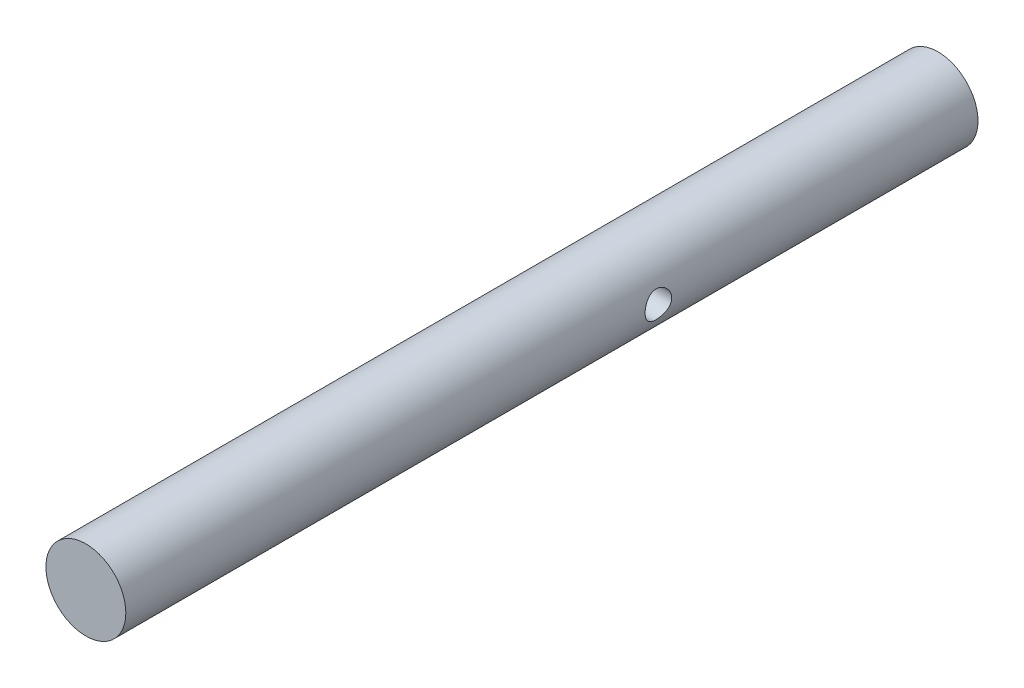
ISO-10303-21;
HEADER;
FILE_DESCRIPTION(('STEP AP214'),'2;1');
FILE_NAME('part.step','',(''),(''),'','','');
FILE_SCHEMA(('AUTOMOTIVE_DESIGN { 1 0 10303 214 1 1 1 1 }'));
ENDSEC;
DATA;
#1=APPLICATION_CONTEXT('core data for automotive mechanical design processes');
#2=APPLICATION_PROTOCOL_DEFINITION('international standard','automotive_design',2000,#1);
#3=PRODUCT_CONTEXT('',#1,'mechanical');
#4=PRODUCT('Part','Part','',(#3));
#5=PRODUCT_RELATED_PRODUCT_CATEGORY('part','',(#4));
#6=PRODUCT_DEFINITION_FORMATION('','',#4);
#7=PRODUCT_DEFINITION_CONTEXT('part definition',#1,'design');
#8=PRODUCT_DEFINITION('design','',#6,#7);
#9=PRODUCT_DEFINITION_SHAPE('','',#8);
#10=(LENGTH_UNIT() NAMED_UNIT(*) SI_UNIT(.MILLI.,.METRE.));
#11=(NAMED_UNIT(*) PLANE_ANGLE_UNIT() SI_UNIT($,.RADIAN.));
#12=(NAMED_UNIT(*) SI_UNIT($,.STERADIAN.) SOLID_ANGLE_UNIT());
#13=UNCERTAINTY_MEASURE_WITH_UNIT(LENGTH_MEASURE(1.E-05),#10,'distance_accuracy_value','');
#14=(GEOMETRIC_REPRESENTATION_CONTEXT(3) GLOBAL_UNCERTAINTY_ASSIGNED_CONTEXT((#13)) GLOBAL_UNIT_ASSIGNED_CONTEXT((#10,
#11,#12)) REPRESENTATION_CONTEXT('',''));
#15=CARTESIAN_POINT('',(0.,0.,0.));
#16=DIRECTION('',(0.,0.,1.));
#17=DIRECTION('',(1.,0.,0.));
#18=AXIS2_PLACEMENT_3D('',#15,#16,#17);
#19=CARTESIAN_POINT('',(0.,0.,101.6));
#20=DIRECTION('',(0.,0.,-1.));
#21=DIRECTION('',(-1.,0.,0.));
#22=AXIS2_PLACEMENT_3D('',#19,#20,#21);
#23=CYLINDRICAL_SURFACE('',#22,4.7625);
#24=CARTESIAN_POINT('',(0.,0.,101.6));
#25=DIRECTION('',(0.,0.,1.));
#26=DIRECTION('',(1.,0.,0.));
#27=AXIS2_PLACEMENT_3D('',#24,#25,#26);
#28=CIRCLE('',#27,4.7625);
#29=CARTESIAN_POINT('',(4.7625,0.,101.6));
#30=VERTEX_POINT('',#29);
#31=EDGE_CURVE('E45',#30,#30,#28,.T.);
#32=ORIENTED_EDGE('',*,*,#31,.F.);
#33=EDGE_LOOP('',(#32));
#34=FACE_BOUND('',#33,.T.);
#35=CARTESIAN_POINT('',(0.,0.,0.));
#36=DIRECTION('',(0.,0.,1.));
#37=DIRECTION('',(1.,0.,0.));
#38=AXIS2_PLACEMENT_3D('',#35,#36,#37);
#39=CIRCLE('',#38,4.7625);
#40=CARTESIAN_POINT('',(4.7625,0.,0.));
#41=VERTEX_POINT('',#40);
#42=EDGE_CURVE('E49',#41,#41,#39,.T.);
#43=ORIENTED_EDGE('',*,*,#42,.T.);
#44=EDGE_LOOP('',(#43));
#45=FACE_BOUND('',#44,.T.);
#46=CARTESIAN_POINT('',(-4.7625,0.,39.6875));
#47=CARTESIAN_POINT('',(-4.76250024290248,0.0866193385826731,39.687500402799));
#48=CARTESIAN_POINT('',(-4.76011509093227,0.173236246329948,39.680387577523));
#49=CARTESIAN_POINT('',(-4.75083521197708,0.343918795385843,39.6522112897526));
#50=CARTESIAN_POINT('',(-4.74394001683417,0.427984170888623,39.6311463789811));
#51=CARTESIAN_POINT('',(-4.72638926301478,0.591078303334069,39.5758682011278));
#52=CARTESIAN_POINT('',(-4.7157399927273,0.670115223594078,39.5416769133459));
#53=CARTESIAN_POINT('',(-4.6917680757628,0.821332712178451,39.4612158881191));
#54=CARTESIAN_POINT('',(-4.67844490185098,0.893511924171945,39.4149437680584));
#55=CARTESIAN_POINT('',(-4.65001124928271,1.03146490909785,39.3099515347867));
#56=CARTESIAN_POINT('',(-4.63485795886259,1.09696837422356,39.2508879156115));
#57=CARTESIAN_POINT('',(-4.60470749718205,1.21734689966455,39.1227196419033));
#58=CARTESIAN_POINT('',(-4.58971036098747,1.27221961946452,39.053612782051));
#59=CARTESIAN_POINT('',(-4.56109915307672,1.37132209578672,38.9048861296256));
#60=CARTESIAN_POINT('',(-4.54753724850155,1.41520046242589,38.8250211881752));
#61=CARTESIAN_POINT('',(-4.52398297352029,1.48878746228088,38.658520450047));
#62=CARTESIAN_POINT('',(-4.51398951405184,1.51850041960149,38.5718867290041));
#63=CARTESIAN_POINT('',(-4.49915443940136,1.56189912014579,38.397381260874));
#64=CARTESIAN_POINT('',(-4.49415052034258,1.57609134913143,38.3096496815236));
#65=CARTESIAN_POINT('',(-4.48938104899343,1.58962903329348,38.1329187902775));
#66=CARTESIAN_POINT('',(-4.48961387798584,1.58897907629748,38.0439198786242));
#67=CARTESIAN_POINT('',(-4.49514936325486,1.57324409712917,37.8715005991701));
#68=CARTESIAN_POINT('',(-4.50021985189709,1.5588200871526,37.788011160366));
#69=CARTESIAN_POINT('',(-4.51447944137725,1.51702478352344,37.6247129463742));
#70=CARTESIAN_POINT('',(-4.52366903532271,1.48965193971459,37.5449046131218));
#71=CARTESIAN_POINT('',(-4.54529683920858,1.42230325467058,37.3897322600235));
#72=CARTESIAN_POINT('',(-4.55778498196574,1.38213155232277,37.3144605095671));
#73=CARTESIAN_POINT('',(-4.58458186738966,1.29046145625623,37.1715174331059));
#74=CARTESIAN_POINT('',(-4.59889113542361,1.23895979087785,37.1038483109933));
#75=CARTESIAN_POINT('',(-4.62863135053789,1.12291706563305,36.9743170879198));
#76=CARTESIAN_POINT('',(-4.64408185600813,1.05783562574614,36.9129425974669));
#77=CARTESIAN_POINT('',(-4.67371014689421,0.91811406732747,36.8018516141719));
#78=CARTESIAN_POINT('',(-4.68788781016682,0.843473033111536,36.7521362394139));
#79=CARTESIAN_POINT('',(-4.71355908851247,0.685716835710943,36.6653821233768));
#80=CARTESIAN_POINT('',(-4.72502468137762,0.602524951310927,36.6284740324966));
#81=CARTESIAN_POINT('',(-4.7437765034179,0.430639669841147,36.5693274613453));
#82=CARTESIAN_POINT('',(-4.75106418427121,0.34194819557098,36.5470838852653));
#83=CARTESIAN_POINT('',(-4.76039857975912,0.165709329377761,36.5187616301895));
#84=CARTESIAN_POINT('',(-4.76265877911043,0.0782789897854344,36.5120240529383));
#85=CARTESIAN_POINT('',(-4.76232383028039,-0.096480423561885,36.5130281193376));
#86=CARTESIAN_POINT('',(-4.75972950165738,-0.183809511919953,36.520767318968));
#87=CARTESIAN_POINT('',(-4.75011789238403,-0.353250287758013,36.5499839035308));
#88=CARTESIAN_POINT('',(-4.74323090454018,-0.435439830850322,36.5710568521036));
#89=CARTESIAN_POINT('',(-4.72585806842736,-0.595083834245081,36.6258370930909));
#90=CARTESIAN_POINT('',(-4.71537176124097,-0.67253768925742,36.6595459966551));
#91=CARTESIAN_POINT('',(-4.69152178418572,-0.822782670524327,36.7396243105472));
#92=CARTESIAN_POINT('',(-4.6780896842481,-0.895397560257227,36.786303416837));
#93=CARTESIAN_POINT('',(-4.64987090592067,-1.03197791784025,36.8906332131464));
#94=CARTESIAN_POINT('',(-4.63508381455201,-1.09594073387548,36.9482872539504));
#95=CARTESIAN_POINT('',(-4.60496996168956,-1.2164258561425,37.076028767223));
#96=CARTESIAN_POINT('',(-4.58964920726292,-1.27247803867767,37.1465621477464));
#97=CARTESIAN_POINT('',(-4.5608870760535,-1.37200881668868,37.2963623638998));
#98=CARTESIAN_POINT('',(-4.54744571493928,-1.41548730734049,37.3756292723316));
#99=CARTESIAN_POINT('',(-4.52409546968821,-1.48843512703598,37.5406809117727));
#100=CARTESIAN_POINT('',(-4.51417945258854,-1.51793278481198,37.6264520506804));
#101=CARTESIAN_POINT('',(-4.49914696286489,-1.56193278348048,37.8021511069451));
#102=CARTESIAN_POINT('',(-4.49402832815027,-1.57644187973938,37.8920771325794));
#103=CARTESIAN_POINT('',(-4.48941600962756,-1.58952609843278,38.068562889965));
#104=CARTESIAN_POINT('',(-4.48964685408646,-1.58888153347709,38.1550582152053));
#105=CARTESIAN_POINT('',(-4.49502640845389,-1.5735971408498,38.3266395564388));
#106=CARTESIAN_POINT('',(-4.50017482566362,-1.55895814614051,38.4117256560037));
#107=CARTESIAN_POINT('',(-4.51460432334015,-1.51665275334284,38.5764653650164));
#108=CARTESIAN_POINT('',(-4.52380505610683,-1.48923906179963,38.6561914596946));
#109=CARTESIAN_POINT('',(-4.54527283124319,-1.4223672431436,38.8099735085145));
#110=CARTESIAN_POINT('',(-4.55754055411887,-1.38290644257917,38.884028199511));
#111=CARTESIAN_POINT('',(-4.58442741396348,-1.2910513494762,39.0278678260026));
#112=CARTESIAN_POINT('',(-4.59912579731893,-1.23816783538877,39.0973254467637));
#113=CARTESIAN_POINT('',(-4.62888578099664,-1.12179557697785,39.2266325787474));
#114=CARTESIAN_POINT('',(-4.64394748298391,-1.05830383406673,39.2864793639048));
#115=CARTESIAN_POINT('',(-4.67344173459301,-0.919545971611597,39.3972167545091));
#116=CARTESIAN_POINT('',(-4.68782688609495,-0.843917402680825,39.4476674020547));
#117=CARTESIAN_POINT('',(-4.71370010986521,-0.684779804883021,39.5350848058004));
#118=CARTESIAN_POINT('',(-4.72518892253839,-0.601272797535107,39.5720550091512));
#119=CARTESIAN_POINT('',(-4.7435375517131,-0.432583664931551,39.6299080915758));
#120=CARTESIAN_POINT('',(-4.75058124720755,-0.347643065311302,39.6514359151931));
#121=CARTESIAN_POINT('',(-4.76006171214452,-0.175133660416269,39.6802296955749));
#122=CARTESIAN_POINT('',(-4.76249975444399,-0.0875655880903858,39.6874995928007));
#123=CARTESIAN_POINT('',(-4.7625,0.,39.6875));
#124=B_SPLINE_CURVE_WITH_KNOTS('',3,(#46,#47,#48,#49,#50,#51,#52,#53,#54,#55,#56,#57,#58,#59,
#60,#61,#62,#63,#64,#65,#66,#67,#68,#69,#70,#71,#72,#73,#74,#75,#76,#77,#78,#79,#80,#81,#82,#83,
#84,#85,#86,#87,#88,#89,#90,#91,#92,#93,#94,#95,#96,#97,#98,#99,#100,#101,#102,#103,#104,#105,
#106,#107,#108,#109,#110,#111,#112,#113,#114,#115,#116,#117,#118,#119,#120,#121,#122,#123),
.UNSPECIFIED.,.T.,.F.,(4,2,2,2,2,2,2,2,2,2,2,2,2,2,2,2,2,2,2,2,2,2,2,2,2,2,2,2,2,2,2,2,2,2,2,2,
2,2,4),(0.,0.259535780816293,0.519098506612188,0.77822849318156,1.03740962475607,
1.30468186298875,1.57201287843954,1.84703060907259,2.12196433449873,2.38763057115171,
2.65321468955133,2.90666212150156,3.16013990233077,3.41769971708769,3.67533400311153,
3.94641872975544,4.21752944222006,4.49132968969942,4.76503474342567,5.02687563290581,
5.28867232148129,5.54288575790413,5.79713161888514,6.0580650975193,6.31907837054751,
6.59195123823193,6.86482638073057,7.13714621949997,7.40934326970521,7.66755619877009,
7.92575375970307,8.17904744490162,8.43239738104363,8.69680230873238,8.96128210158997,
9.2360696157572,9.51078681329523,9.77323036418427,10.0356013733555),.UNSPECIFIED.);
#125=CARTESIAN_POINT('',(-4.7625,0.,39.6875));
#126=VERTEX_POINT('',#125);
#127=EDGE_CURVE('E41',#126,#126,#124,.T.);
#128=ORIENTED_EDGE('',*,*,#127,.F.);
#129=EDGE_LOOP('',(#128));
#130=FACE_BOUND('',#129,.T.);
#131=CARTESIAN_POINT('',(4.7625,0.,39.6875));
#132=CARTESIAN_POINT('',(4.76250024290249,-0.086619338582678,39.687500402799));
#133=CARTESIAN_POINT('',(4.76011509093227,-0.173236246329953,39.680387577523));
#134=CARTESIAN_POINT('',(4.75083521197708,-0.343918795385849,39.6522112897527));
#135=CARTESIAN_POINT('',(4.74394001683417,-0.427984170888628,39.6311463789811));
#136=CARTESIAN_POINT('',(4.72638926301478,-0.591078303334074,39.5758682011278));
#137=CARTESIAN_POINT('',(4.7157399927273,-0.670115223594083,39.5416769133459));
#138=CARTESIAN_POINT('',(4.6917680757628,-0.821332712178457,39.4612158881191));
#139=CARTESIAN_POINT('',(4.67844490185097,-0.89351192417195,39.4149437680584));
#140=CARTESIAN_POINT('',(4.6500112492827,-1.03146490909785,39.3099515347867));
#141=CARTESIAN_POINT('',(4.63485795886258,-1.09696837422357,39.2508879156115));
#142=CARTESIAN_POINT('',(4.60470749718205,-1.21734689966456,39.1227196419033));
#143=CARTESIAN_POINT('',(4.58971036098746,-1.27221961946453,39.053612782051));
#144=CARTESIAN_POINT('',(4.56109915307672,-1.37132209578673,38.9048861296256));
#145=CARTESIAN_POINT('',(4.54753724850155,-1.41520046242589,38.8250211881752));
#146=CARTESIAN_POINT('',(4.52398297352029,-1.48878746228089,38.658520450047));
#147=CARTESIAN_POINT('',(4.51398951405184,-1.51850041960149,38.5718867290041));
#148=CARTESIAN_POINT('',(4.49915443940136,-1.5618991201458,38.397381260874));
#149=CARTESIAN_POINT('',(4.49415052034258,-1.57609134913144,38.3096496815236));
#150=CARTESIAN_POINT('',(4.48938104899343,-1.58962903329349,38.1329187902775));
#151=CARTESIAN_POINT('',(4.48961387798584,-1.58897907629749,38.0439198786242));
#152=CARTESIAN_POINT('',(4.49514936325486,-1.57324409712918,37.8715005991701));
#153=CARTESIAN_POINT('',(4.50021985189708,-1.55882008715261,37.788011160366));
#154=CARTESIAN_POINT('',(4.51447944137724,-1.51702478352345,37.6247129463742));
#155=CARTESIAN_POINT('',(4.52366903532271,-1.4896519397146,37.5449046131218));
#156=CARTESIAN_POINT('',(4.54529683920857,-1.42230325467059,37.3897322600235));
#157=CARTESIAN_POINT('',(4.55778498196574,-1.38213155232278,37.3144605095671));
#158=CARTESIAN_POINT('',(4.58458186738966,-1.29046145625624,37.1715174331059));
#159=CARTESIAN_POINT('',(4.59889113542361,-1.23895979087786,37.1038483109933));
#160=CARTESIAN_POINT('',(4.62863135053789,-1.12291706563306,36.9743170879198));
#161=CARTESIAN_POINT('',(4.64408185600813,-1.05783562574615,36.9129425974669));
#162=CARTESIAN_POINT('',(4.67371014689421,-0.918114067327481,36.8018516141719));
#163=CARTESIAN_POINT('',(4.68788781016682,-0.843473033111548,36.7521362394139));
#164=CARTESIAN_POINT('',(4.71355908851247,-0.685716835710955,36.6653821233768));
#165=CARTESIAN_POINT('',(4.72502468137762,-0.602524951310938,36.6284740324966));
#166=CARTESIAN_POINT('',(4.7437765034179,-0.430639669841158,36.5693274613453));
#167=CARTESIAN_POINT('',(4.75106418427121,-0.341948195570991,36.5470838852653));
#168=CARTESIAN_POINT('',(4.76039857975912,-0.165709329377772,36.5187616301895));
#169=CARTESIAN_POINT('',(4.76265877911043,-0.0782789897854453,36.5120240529383));
#170=CARTESIAN_POINT('',(4.76232383028039,0.0964804235618743,36.5130281193376));
#171=CARTESIAN_POINT('',(4.75972950165738,0.183809511919942,36.520767318968));
#172=CARTESIAN_POINT('',(4.75011789238403,0.353250287758003,36.5499839035308));
#173=CARTESIAN_POINT('',(4.74323090454018,0.435439830850311,36.5710568521036));
#174=CARTESIAN_POINT('',(4.72585806842736,0.59508383424507,36.6258370930909));
#175=CARTESIAN_POINT('',(4.71537176124097,0.672537689257409,36.6595459966551));
#176=CARTESIAN_POINT('',(4.69152178418573,0.822782670524315,36.7396243105472));
#177=CARTESIAN_POINT('',(4.67808968424811,0.895397560257213,36.786303416837));
#178=CARTESIAN_POINT('',(4.64987090592067,1.03197791784024,36.8906332131464));
#179=CARTESIAN_POINT('',(4.63508381455201,1.09594073387547,36.9482872539504));
#180=CARTESIAN_POINT('',(4.60496996168956,1.21642585614249,37.076028767223));
#181=CARTESIAN_POINT('',(4.58964920726292,1.27247803867765,37.1465621477464));
#182=CARTESIAN_POINT('',(4.5608870760535,1.37200881668867,37.2963623638998));
#183=CARTESIAN_POINT('',(4.54744571493929,1.41548730734048,37.3756292723316));
#184=CARTESIAN_POINT('',(4.52409546968822,1.48843512703597,37.5406809117727));
#185=CARTESIAN_POINT('',(4.51417945258854,1.51793278481196,37.6264520506804));
#186=CARTESIAN_POINT('',(4.49914696286489,1.56193278348047,37.8021511069451));
#187=CARTESIAN_POINT('',(4.49402832815028,1.57644187973937,37.8920771325794));
#188=CARTESIAN_POINT('',(4.48941600962757,1.58952609843277,38.068562889965));
#189=CARTESIAN_POINT('',(4.48964685408647,1.58888153347708,38.1550582152053));
#190=CARTESIAN_POINT('',(4.4950264084539,1.5735971408498,38.3266395564388));
#191=CARTESIAN_POINT('',(4.50017482566362,1.5589581461405,38.4117256560037));
#192=CARTESIAN_POINT('',(4.51460432334016,1.51665275334283,38.5764653650164));
#193=CARTESIAN_POINT('',(4.52380505610683,1.48923906179962,38.6561914596946));
#194=CARTESIAN_POINT('',(4.54527283124319,1.42236724314359,38.8099735085145));
#195=CARTESIAN_POINT('',(4.55754055411887,1.38290644257916,38.884028199511));
#196=CARTESIAN_POINT('',(4.58442741396349,1.29105134947619,39.0278678260026));
#197=CARTESIAN_POINT('',(4.59912579731893,1.23816783538876,39.0973254467637));
#198=CARTESIAN_POINT('',(4.62888578099664,1.12179557697784,39.2266325787474));
#199=CARTESIAN_POINT('',(4.64394748298391,1.05830383406672,39.2864793639048));
#200=CARTESIAN_POINT('',(4.67344173459301,0.919545971611587,39.3972167545091));
#201=CARTESIAN_POINT('',(4.68782688609495,0.843917402680815,39.4476674020547));
#202=CARTESIAN_POINT('',(4.71370010986522,0.684779804883012,39.5350848058004));
#203=CARTESIAN_POINT('',(4.72518892253839,0.601272797535097,39.5720550091512));
#204=CARTESIAN_POINT('',(4.7435375517131,0.432583664931543,39.6299080915758));
#205=CARTESIAN_POINT('',(4.75058124720755,0.347643065311294,39.6514359151931));
#206=CARTESIAN_POINT('',(4.76006171214452,0.175133660416263,39.6802296955749));
#207=CARTESIAN_POINT('',(4.76249975444399,0.0875655880903806,39.6874995928007));
#208=CARTESIAN_POINT('',(4.7625,0.,39.6875));
#209=B_SPLINE_CURVE_WITH_KNOTS('',3,(#131,#132,#133,#134,#135,#136,#137,#138,#139,#140,#141,
#142,#143,#144,#145,#146,#147,#148,#149,#150,#151,#152,#153,#154,#155,#156,#157,#158,#159,#160,
#161,#162,#163,#164,#165,#166,#167,#168,#169,#170,#171,#172,#173,#174,#175,#176,#177,#178,#179,
#180,#181,#182,#183,#184,#185,#186,#187,#188,#189,#190,#191,#192,#193,#194,#195,#196,#197,#198,
#199,#200,#201,#202,#203,#204,#205,#206,#207,#208),.UNSPECIFIED.,.T.,.F.,(4,2,2,2,2,2,2,2,2,2,2,
2,2,2,2,2,2,2,2,2,2,2,2,2,2,2,2,2,2,2,2,2,2,2,2,2,2,2,4),(0.,0.259535780816293,0.51909850661219,
0.778228493181558,1.03740962475607,1.30468186298875,1.57201287843954,1.8470306090726,
2.12196433449873,2.38763057115171,2.65321468955133,2.90666212150157,3.16013990233077,
3.4176997170877,3.67533400311154,3.94641872975545,4.21752944222006,4.49132968969942,
4.76503474342568,5.02687563290582,5.2886723214813,5.54288575790414,5.79713161888515,
6.05806509751931,6.31907837054751,6.59195123823192,6.86482638073057,7.13714621949998,
7.40934326970521,7.66755619877009,7.92575375970307,8.17904744490162,8.43239738104364,
8.69680230873239,8.96128210158998,9.23606961575721,9.51078681329524,9.77323036418428,
10.0356013733555),.UNSPECIFIED.);
#210=CARTESIAN_POINT('',(4.7625,0.,39.6875));
#211=VERTEX_POINT('',#210);
#212=EDGE_CURVE('E10',#211,#211,#209,.T.);
#213=ORIENTED_EDGE('',*,*,#212,.F.);
#214=EDGE_LOOP('',(#213));
#215=FACE_BOUND('',#214,.T.);
#216=ADVANCED_FACE('F31',(#34,#45,#130,#215),#23,.T.);
#217=CARTESIAN_POINT('',(0.,0.,101.6));
#218=DIRECTION('',(0.,0.,1.));
#219=DIRECTION('',(1.,0.,0.));
#220=AXIS2_PLACEMENT_3D('',#217,#218,#219);
#221=PLANE('',#220);
#222=ORIENTED_EDGE('',*,*,#31,.T.);
#223=EDGE_LOOP('',(#222));
#224=FACE_BOUND('',#223,.T.);
#225=ADVANCED_FACE('F59',(#224),#221,.T.);
#226=CARTESIAN_POINT('',(0.,0.,0.));
#227=DIRECTION('',(0.,0.,1.));
#228=DIRECTION('',(1.,0.,0.));
#229=AXIS2_PLACEMENT_3D('',#226,#227,#228);
#230=PLANE('',#229);
#231=ORIENTED_EDGE('',*,*,#42,.F.);
#232=EDGE_LOOP('',(#231));
#233=FACE_BOUND('',#232,.T.);
#234=ADVANCED_FACE('F58',(#233),#230,.F.);
#235=CARTESIAN_POINT('',(4.7625,0.,38.1));
#236=DIRECTION('',(-1.,0.,0.));
#237=DIRECTION('',(0.,0.,1.));
#238=AXIS2_PLACEMENT_3D('',#235,#236,#237);
#239=CYLINDRICAL_SURFACE('',#238,1.5875);
#240=ORIENTED_EDGE('',*,*,#127,.T.);
#241=EDGE_LOOP('',(#240));
#242=FACE_BOUND('',#241,.T.);
#243=ORIENTED_EDGE('',*,*,#212,.T.);
#244=EDGE_LOOP('',(#243));
#245=FACE_BOUND('',#244,.T.);
#246=ADVANCED_FACE('F54',(#242,#245),#239,.F.);
#247=CLOSED_SHELL('',(#216,#225,#234,#246));
#248=MANIFOLD_SOLID_BREP('B2',#247);
#249=ADVANCED_BREP_SHAPE_REPRESENTATION('',(#18,#248),#14);
#250=SHAPE_DEFINITION_REPRESENTATION(#9,#249);
ENDSEC;
END-ISO-10303-21;
